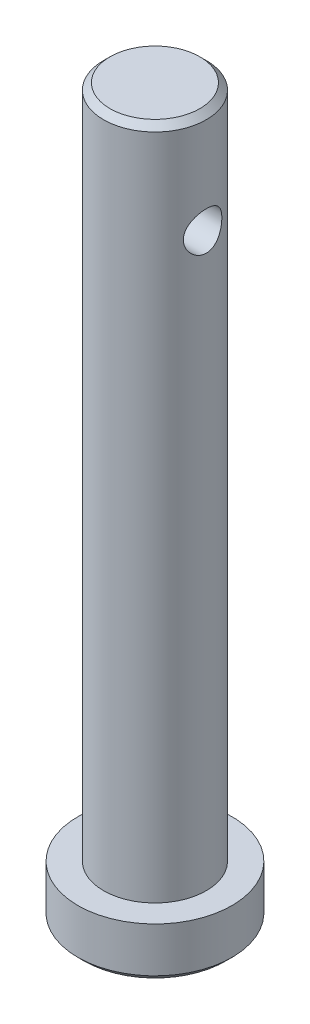
ISO-10303-21;
HEADER;
FILE_DESCRIPTION(('STEP AP214'),'2;1');
FILE_NAME('part.step','',(''),(''),'','','');
FILE_SCHEMA(('AUTOMOTIVE_DESIGN { 1 0 10303 214 1 1 1 1 }'));
ENDSEC;
DATA;
#1=APPLICATION_CONTEXT('core data for automotive mechanical design processes');
#2=APPLICATION_PROTOCOL_DEFINITION('international standard','automotive_design',2000,#1);
#3=PRODUCT_CONTEXT('',#1,'mechanical');
#4=PRODUCT('Part','Part','',(#3));
#5=PRODUCT_RELATED_PRODUCT_CATEGORY('part','',(#4));
#6=PRODUCT_DEFINITION_FORMATION('','',#4);
#7=PRODUCT_DEFINITION_CONTEXT('part definition',#1,'design');
#8=PRODUCT_DEFINITION('design','',#6,#7);
#9=PRODUCT_DEFINITION_SHAPE('','',#8);
#10=(LENGTH_UNIT() NAMED_UNIT(*) SI_UNIT(.MILLI.,.METRE.));
#11=(NAMED_UNIT(*) PLANE_ANGLE_UNIT() SI_UNIT($,.RADIAN.));
#12=(NAMED_UNIT(*) SI_UNIT($,.STERADIAN.) SOLID_ANGLE_UNIT());
#13=UNCERTAINTY_MEASURE_WITH_UNIT(LENGTH_MEASURE(1.E-05),#10,'distance_accuracy_value','');
#14=(GEOMETRIC_REPRESENTATION_CONTEXT(3) GLOBAL_UNCERTAINTY_ASSIGNED_CONTEXT((#13)) GLOBAL_UNIT_ASSIGNED_CONTEXT((#10,
#11,#12)) REPRESENTATION_CONTEXT('',''));
#15=CARTESIAN_POINT('',(0.,0.,0.));
#16=DIRECTION('',(0.,0.,1.));
#17=DIRECTION('',(1.,0.,0.));
#18=AXIS2_PLACEMENT_3D('',#15,#16,#17);
#19=CARTESIAN_POINT('',(0.,8.,0.));
#20=DIRECTION('',(0.,-1.,0.));
#21=DIRECTION('',(0.,0.,-1.));
#22=AXIS2_PLACEMENT_3D('',#19,#20,#21);
#23=CYLINDRICAL_SURFACE('',#22,12.);
#24=CARTESIAN_POINT('',(0.,1.,0.));
#25=DIRECTION('',(0.,1.,0.));
#26=DIRECTION('',(0.,0.,1.));
#27=AXIS2_PLACEMENT_3D('',#24,#25,#26);
#28=CIRCLE('',#27,12.);
#29=CARTESIAN_POINT('',(0.,1.,12.));
#30=VERTEX_POINT('',#29);
#31=EDGE_CURVE('E111',#30,#30,#28,.T.);
#32=ORIENTED_EDGE('',*,*,#31,.T.);
#33=EDGE_LOOP('',(#32));
#34=FACE_BOUND('',#33,.T.);
#35=CARTESIAN_POINT('',(0.,8.,0.));
#36=DIRECTION('',(0.,1.,0.));
#37=DIRECTION('',(0.,0.,1.));
#38=AXIS2_PLACEMENT_3D('',#35,#36,#37);
#39=CIRCLE('',#38,12.);
#40=CARTESIAN_POINT('',(0.,8.,12.));
#41=VERTEX_POINT('',#40);
#42=EDGE_CURVE('E112',#41,#41,#39,.T.);
#43=ORIENTED_EDGE('',*,*,#42,.F.);
#44=EDGE_LOOP('',(#43));
#45=FACE_BOUND('',#44,.T.);
#46=ADVANCED_FACE('F39',(#34,#45),#23,.T.);
#47=CARTESIAN_POINT('',(0.,8.,0.));
#48=DIRECTION('',(0.,1.,0.));
#49=DIRECTION('',(0.,0.,1.));
#50=AXIS2_PLACEMENT_3D('',#47,#48,#49);
#51=PLANE('',#50);
#52=CARTESIAN_POINT('',(0.,8.,0.));
#53=DIRECTION('',(0.,1.,0.));
#54=DIRECTION('',(0.,0.,1.));
#55=AXIS2_PLACEMENT_3D('',#52,#53,#54);
#56=CIRCLE('',#55,8.);
#57=CARTESIAN_POINT('',(0.,8.,8.));
#58=VERTEX_POINT('',#57);
#59=EDGE_CURVE('E58',#58,#58,#56,.T.);
#60=ORIENTED_EDGE('',*,*,#59,.F.);
#61=EDGE_LOOP('',(#60));
#62=FACE_BOUND('',#61,.T.);
#63=ORIENTED_EDGE('',*,*,#42,.T.);
#64=EDGE_LOOP('',(#63));
#65=FACE_BOUND('',#64,.T.);
#66=ADVANCED_FACE('F87',(#62,#65),#51,.T.);
#67=CARTESIAN_POINT('',(0.,0.,0.));
#68=DIRECTION('',(0.,1.,0.));
#69=DIRECTION('',(0.,0.,1.));
#70=AXIS2_PLACEMENT_3D('',#67,#68,#69);
#71=PLANE('',#70);
#72=CARTESIAN_POINT('',(0.,0.,0.));
#73=DIRECTION('',(0.,1.,0.));
#74=DIRECTION('',(0.,0.,1.));
#75=AXIS2_PLACEMENT_3D('',#72,#73,#74);
#76=CIRCLE('',#75,11.);
#77=CARTESIAN_POINT('',(0.,0.,11.));
#78=VERTEX_POINT('',#77);
#79=EDGE_CURVE('E109',#78,#78,#76,.F.);
#80=ORIENTED_EDGE('',*,*,#79,.T.);
#81=EDGE_LOOP('',(#80));
#82=FACE_BOUND('',#81,.T.);
#83=ADVANCED_FACE('F93',(#82),#71,.F.);
#84=CARTESIAN_POINT('',(0.,1.,0.));
#85=DIRECTION('',(0.,1.,0.));
#86=DIRECTION('',(0.,0.,1.));
#87=AXIS2_PLACEMENT_3D('',#84,#85,#86);
#88=CONICAL_SURFACE('',#87,12.,0.785398163397449);
#89=ORIENTED_EDGE('',*,*,#79,.F.);
#90=EDGE_LOOP('',(#89));
#91=FACE_BOUND('',#90,.T.);
#92=ORIENTED_EDGE('',*,*,#31,.F.);
#93=EDGE_LOOP('',(#92));
#94=FACE_BOUND('',#93,.T.);
#95=ADVANCED_FACE('F84',(#91,#94),#88,.T.);
#96=CARTESIAN_POINT('',(0.,113.,0.));
#97=DIRECTION('',(0.,-1.,0.));
#98=DIRECTION('',(0.,0.,-1.));
#99=AXIS2_PLACEMENT_3D('',#96,#97,#98);
#100=CYLINDRICAL_SURFACE('',#99,8.);
#101=CARTESIAN_POINT('',(-7.41619848709566,97.,-3.00000000000001));
#102=CARTESIAN_POINT('',(-7.41619281215226,97.1620149674834,-3.00000608211288));
#103=CARTESIAN_POINT('',(-7.42156520296313,97.3239898451262,-2.98683195095364));
#104=CARTESIAN_POINT('',(-7.44232318425765,97.6430561659352,-2.93472375787484));
#105=CARTESIAN_POINT('',(-7.45770847484803,97.8001477552117,-2.89579046745933));
#106=CARTESIAN_POINT('',(-7.49650960610891,98.1047507431888,-2.79379315222298));
#107=CARTESIAN_POINT('',(-7.51990619151695,98.2522841132919,-2.73078694533006));
#108=CARTESIAN_POINT('',(-7.57206268400017,98.5347437936479,-2.58263713485087));
#109=CARTESIAN_POINT('',(-7.60082420131042,98.6696663005679,-2.49748688189993));
#110=CARTESIAN_POINT('',(-7.66207149335192,98.9297806232427,-2.30293322748412));
#111=CARTESIAN_POINT('',(-7.69466683848217,99.054257059258,-2.19260762426636));
#112=CARTESIAN_POINT('',(-7.75899501256083,99.2834456293438,-1.95279167955761));
#113=CARTESIAN_POINT('',(-7.79072765629295,99.3881535474839,-1.8232972605133));
#114=CARTESIAN_POINT('',(-7.8510574787339,99.578279024591,-1.54338931035527));
#115=CARTESIAN_POINT('',(-7.87951122447087,99.6629189494317,-1.39241389507608));
#116=CARTESIAN_POINT('',(-7.92876015947619,99.8053023450499,-1.07711154393048));
#117=CARTESIAN_POINT('',(-7.94955800433994,99.863055143984,-0.912789261867069));
#118=CARTESIAN_POINT('',(-7.98037394206897,99.9475157915492,-0.582978683353672));
#119=CARTESIAN_POINT('',(-7.99081830429549,99.9754552548809,-0.4178463945632));
#120=CARTESIAN_POINT('',(-8.0012802821588,100.00344240189,-0.0849287275895698));
#121=CARTESIAN_POINT('',(-8.0013012882982,100.003499155237,0.082855770125677));
#122=CARTESIAN_POINT('',(-7.99118531807774,99.9764364770697,0.407487086128937));
#123=CARTESIAN_POINT('',(-7.98155083993307,99.9506614041024,0.564464356533753));
#124=CARTESIAN_POINT('',(-7.95386549864585,99.8749281695488,0.871678435968828));
#125=CARTESIAN_POINT('',(-7.93581403951378,99.8249682954757,1.02191476686077));
#126=CARTESIAN_POINT('',(-7.89275538334835,99.7016590966486,1.31397803460604));
#127=CARTESIAN_POINT('',(-7.86765078939303,99.6279799894642,1.45565078457397));
#128=CARTESIAN_POINT('',(-7.81302620451409,99.4596158061402,1.72497321591576));
#129=CARTESIAN_POINT('',(-7.78350479028858,99.364923953961,1.85261835386705));
#130=CARTESIAN_POINT('',(-7.72105059308269,99.1507454274377,2.09818097359933));
#131=CARTESIAN_POINT('',(-7.68801927514871,99.0301321687147,2.21509229051721));
#132=CARTESIAN_POINT('',(-7.62364921304341,98.7708140133413,2.42740791139661));
#133=CARTESIAN_POINT('',(-7.59231089545926,98.6321045867686,2.5228068138945));
#134=CARTESIAN_POINT('',(-7.53425406951149,98.3365610651226,2.69131223613209));
#135=CARTESIAN_POINT('',(-7.50765354114236,98.1793930128285,2.76387695690677));
#136=CARTESIAN_POINT('',(-7.4634487707231,97.8538075498722,2.88112928869848));
#137=CARTESIAN_POINT('',(-7.44583952363152,97.6853964568743,2.925832412077));
#138=CARTESIAN_POINT('',(-7.4227919449154,97.3520480753245,2.98380383422379));
#139=CARTESIAN_POINT('',(-7.41673570495336,97.187431788916,2.99867042318746));
#140=CARTESIAN_POINT('',(-7.41573079037772,96.8579812865282,3.00115771271732));
#141=CARTESIAN_POINT('',(-7.42077934004762,96.6931471352981,2.98878522187311));
#142=CARTESIAN_POINT('',(-7.44078763262528,96.3761401554217,2.93859467040517));
#143=CARTESIAN_POINT('',(-7.45526552433718,96.2237377284699,2.90201236668504));
#144=CARTESIAN_POINT('',(-7.49192974091902,95.9273041105604,2.80599549281221));
#145=CARTESIAN_POINT('',(-7.51411764500121,95.7832746416639,2.74655624069232));
#146=CARTESIAN_POINT('',(-7.56472486232391,95.5016711238473,2.60400584550572));
#147=CARTESIAN_POINT('',(-7.59334657784192,95.3645414157252,2.52009090354098));
#148=CARTESIAN_POINT('',(-7.6532562858852,95.105742036548,2.33182635724955));
#149=CARTESIAN_POINT('',(-7.68454525188137,94.9840780507507,2.22746927392869));
#150=CARTESIAN_POINT('',(-7.74866093106386,94.7516632536098,1.99345468180189));
#151=CARTESIAN_POINT('',(-7.7814593871406,94.6420931824625,1.86261268298213));
#152=CARTESIAN_POINT('',(-7.84299749926599,94.4463232648211,1.5835949435063));
#153=CARTESIAN_POINT('',(-7.87173714215327,94.3601234941083,1.43541914664535));
#154=CARTESIAN_POINT('',(-7.92189971409105,94.2141078876007,1.12603265893695));
#155=CARTESIAN_POINT('',(-7.9433476267602,94.1542017524148,0.964868866129253));
#156=CARTESIAN_POINT('',(-7.97658873425142,94.0626871723002,0.633763775046511));
#157=CARTESIAN_POINT('',(-7.98838646598825,94.0310654291552,0.46382664144719));
#158=CARTESIAN_POINT('',(-8.00056814634146,93.9984511944903,0.130671170547637));
#159=CARTESIAN_POINT('',(-8.00157721907528,93.995781033882,-0.0323615361216857));
#160=CARTESIAN_POINT('',(-7.99369779618447,94.0168303188908,-0.356453572824845));
#161=CARTESIAN_POINT('',(-7.98481049426262,94.0405465817717,-0.517513138490513));
#162=CARTESIAN_POINT('',(-7.95842179207541,94.1125177029872,-0.829096496754252));
#163=CARTESIAN_POINT('',(-7.9411358275603,94.1601598117567,-0.979781462137667));
#164=CARTESIAN_POINT('',(-7.89975567241984,94.2780200267687,-1.27103094601278));
#165=CARTESIAN_POINT('',(-7.87566019311345,94.3482424066095,-1.41159354255109));
#166=CARTESIAN_POINT('',(-7.8218123660013,94.5126278870096,-1.68508035398882));
#167=CARTESIAN_POINT('',(-7.79186480217587,94.6076732810283,-1.81743509769369));
#168=CARTESIAN_POINT('',(-7.72999015389759,94.8176156603752,-2.06483469504674));
#169=CARTESIAN_POINT('',(-7.69806236548316,94.9325197316156,-2.17987334251185));
#170=CARTESIAN_POINT('',(-7.63376259478074,95.1861282632902,-2.39562428472387));
#171=CARTESIAN_POINT('',(-7.60145610697262,95.3257688043091,-2.49525999632032));
#172=CARTESIAN_POINT('',(-7.54196650008334,95.6208317391462,-2.66969419113706));
#173=CARTESIAN_POINT('',(-7.51478391266386,95.7762557681052,-2.74449009756384));
#174=CARTESIAN_POINT('',(-7.46804539702406,96.1059113619526,-2.86931773948448));
#175=CARTESIAN_POINT('',(-7.44887606566003,96.2806687330304,-2.91812005798767));
#176=CARTESIAN_POINT('',(-7.42295988688336,96.6369705439047,-2.98344713444438));
#177=CARTESIAN_POINT('',(-7.41620484418155,96.8185104253944,-2.99999318680185));
#178=CARTESIAN_POINT('',(-7.41619848709566,97.,-3.00000000000001));
#179=B_SPLINE_CURVE_WITH_KNOTS('',3,(#101,#102,#103,#104,#105,#106,#107,#108,#109,#110,#111,
#112,#113,#114,#115,#116,#117,#118,#119,#120,#121,#122,#123,#124,#125,#126,#127,#128,#129,#130,
#131,#132,#133,#134,#135,#136,#137,#138,#139,#140,#141,#142,#143,#144,#145,#146,#147,#148,#149,
#150,#151,#152,#153,#154,#155,#156,#157,#158,#159,#160,#161,#162,#163,#164,#165,#166,#167,#168,
#169,#170,#171,#172,#173,#174,#175,#176,#177,#178),.UNSPECIFIED.,.T.,.F.,(4,2,2,2,2,2,2,2,2,2,2,
2,2,2,2,2,2,2,2,2,2,2,2,2,2,2,2,2,2,2,2,2,2,2,2,2,2,2,4),(0.,0.485369082889289,
0.970723629307669,1.45491971362402,1.93926135947585,2.44549304813253,2.95183257656963,
3.47540144283839,3.99878852773657,4.49960036990355,5.00024930820711,5.47612945617385,
5.95204330537668,6.43488262432333,6.91787787268949,7.42913350142746,7.94051735665667,
8.46325184520833,8.98569503290591,9.47931315500613,9.97280790797413,10.4428769187604,
10.913042268787,11.4008312203129,11.8887989695235,12.4077003400689,12.9266033932,
13.4437101779998,13.960573711399,14.4473144111952,14.933996406586,15.4088054802743,
15.8837044704531,16.3785664737362,16.8736054180957,17.394771991038,17.9159926110813,
18.460063577615,19.0037752466575),.UNSPECIFIED.);
#180=CARTESIAN_POINT('',(-7.41619848709566,97.,-3.00000000000001));
#181=VERTEX_POINT('',#180);
#182=EDGE_CURVE('E44',#181,#181,#179,.T.);
#183=ORIENTED_EDGE('',*,*,#182,.T.);
#184=EDGE_LOOP('',(#183));
#185=FACE_BOUND('',#184,.T.);
#186=CARTESIAN_POINT('',(7.41619848709566,97.,-3.00000000000001));
#187=CARTESIAN_POINT('',(7.41619281215226,96.8379850325166,-3.00000608211288));
#188=CARTESIAN_POINT('',(7.42156520296313,96.6760101548738,-2.98683195095364));
#189=CARTESIAN_POINT('',(7.44232318425765,96.3569438340648,-2.93472375787484));
#190=CARTESIAN_POINT('',(7.45770847484803,96.1998522447883,-2.89579046745933));
#191=CARTESIAN_POINT('',(7.49650960610891,95.8952492568112,-2.79379315222298));
#192=CARTESIAN_POINT('',(7.51990619151695,95.7477158867081,-2.73078694533006));
#193=CARTESIAN_POINT('',(7.57206268400017,95.465256206352,-2.58263713485087));
#194=CARTESIAN_POINT('',(7.60082420131042,95.3303336994321,-2.49748688189993));
#195=CARTESIAN_POINT('',(7.66207149335192,95.0702193767573,-2.30293322748412));
#196=CARTESIAN_POINT('',(7.69466683848217,94.945742940742,-2.19260762426636));
#197=CARTESIAN_POINT('',(7.75899501256083,94.7165543706562,-1.95279167955761));
#198=CARTESIAN_POINT('',(7.79072765629295,94.611846452516,-1.8232972605133));
#199=CARTESIAN_POINT('',(7.8510574787339,94.421720975409,-1.54338931035527));
#200=CARTESIAN_POINT('',(7.87951122447087,94.3370810505683,-1.39241389507608));
#201=CARTESIAN_POINT('',(7.92876015947619,94.1946976549501,-1.07711154393048));
#202=CARTESIAN_POINT('',(7.94955800433994,94.136944856016,-0.912789261867069));
#203=CARTESIAN_POINT('',(7.98037394206897,94.0524842084508,-0.582978683353672));
#204=CARTESIAN_POINT('',(7.99081830429549,94.0245447451191,-0.4178463945632));
#205=CARTESIAN_POINT('',(8.0012802821588,93.99655759811,-0.0849287275895698));
#206=CARTESIAN_POINT('',(8.0013012882982,93.9965008447626,0.082855770125677));
#207=CARTESIAN_POINT('',(7.99118531807774,94.0235635229303,0.407487086128937));
#208=CARTESIAN_POINT('',(7.98155083993307,94.0493385958975,0.564464356533753));
#209=CARTESIAN_POINT('',(7.95386549864585,94.1250718304512,0.871678435968828));
#210=CARTESIAN_POINT('',(7.93581403951378,94.1750317045243,1.02191476686077));
#211=CARTESIAN_POINT('',(7.89275538334835,94.2983409033514,1.31397803460604));
#212=CARTESIAN_POINT('',(7.86765078939303,94.3720200105358,1.45565078457397));
#213=CARTESIAN_POINT('',(7.81302620451409,94.5403841938598,1.72497321591576));
#214=CARTESIAN_POINT('',(7.78350479028858,94.635076046039,1.85261835386705));
#215=CARTESIAN_POINT('',(7.72105059308269,94.8492545725623,2.09818097359933));
#216=CARTESIAN_POINT('',(7.68801927514871,94.9698678312853,2.21509229051721));
#217=CARTESIAN_POINT('',(7.62364921304341,95.2291859866586,2.42740791139661));
#218=CARTESIAN_POINT('',(7.59231089545926,95.3678954132314,2.5228068138945));
#219=CARTESIAN_POINT('',(7.53425406951149,95.6634389348773,2.69131223613209));
#220=CARTESIAN_POINT('',(7.50765354114235,95.8206069871714,2.76387695690677));
#221=CARTESIAN_POINT('',(7.4634487707231,96.1461924501277,2.88112928869848));
#222=CARTESIAN_POINT('',(7.44583952363152,96.3146035431257,2.925832412077));
#223=CARTESIAN_POINT('',(7.4227919449154,96.6479519246755,2.98380383422379));
#224=CARTESIAN_POINT('',(7.41673570495336,96.8125682110839,2.99867042318746));
#225=CARTESIAN_POINT('',(7.41573079037772,97.1420187134718,3.00115771271732));
#226=CARTESIAN_POINT('',(7.42077934004762,97.3068528647019,2.98878522187311));
#227=CARTESIAN_POINT('',(7.44078763262528,97.6238598445783,2.93859467040517));
#228=CARTESIAN_POINT('',(7.45526552433718,97.7762622715301,2.90201236668504));
#229=CARTESIAN_POINT('',(7.49192974091902,98.0726958894396,2.80599549281221));
#230=CARTESIAN_POINT('',(7.51411764500121,98.216725358336,2.74655624069232));
#231=CARTESIAN_POINT('',(7.56472486232391,98.4983288761526,2.60400584550571));
#232=CARTESIAN_POINT('',(7.59334657784192,98.6354585842747,2.52009090354098));
#233=CARTESIAN_POINT('',(7.6532562858852,98.894257963452,2.33182635724954));
#234=CARTESIAN_POINT('',(7.68454525188137,99.0159219492493,2.22746927392868));
#235=CARTESIAN_POINT('',(7.74866093106386,99.2483367463902,1.99345468180189));
#236=CARTESIAN_POINT('',(7.7814593871406,99.3579068175375,1.86261268298212));
#237=CARTESIAN_POINT('',(7.84299749926599,99.5536767351789,1.58359494350629));
#238=CARTESIAN_POINT('',(7.87173714215327,99.6398765058917,1.43541914664534));
#239=CARTESIAN_POINT('',(7.92189971409105,99.7858921123992,1.12603265893695));
#240=CARTESIAN_POINT('',(7.9433476267602,99.8457982475852,0.964868866129253));
#241=CARTESIAN_POINT('',(7.97658873425142,99.9373128276998,0.633763775046511));
#242=CARTESIAN_POINT('',(7.98838646598825,99.9689345708448,0.46382664144719));
#243=CARTESIAN_POINT('',(8.00056814634146,100.00154880551,0.130671170547637));
#244=CARTESIAN_POINT('',(8.00157721907528,100.004218966118,-0.0323615361216857));
#245=CARTESIAN_POINT('',(7.99369779618447,99.9831696811092,-0.356453572824845));
#246=CARTESIAN_POINT('',(7.98481049426262,99.9594534182283,-0.517513138490513));
#247=CARTESIAN_POINT('',(7.95842179207541,99.8874822970128,-0.829096496754252));
#248=CARTESIAN_POINT('',(7.9411358275603,99.8398401882433,-0.979781462137667));
#249=CARTESIAN_POINT('',(7.89975567241984,99.7219799732313,-1.27103094601278));
#250=CARTESIAN_POINT('',(7.87566019311345,99.6517575933905,-1.41159354255109));
#251=CARTESIAN_POINT('',(7.8218123660013,99.4873721129904,-1.68508035398882));
#252=CARTESIAN_POINT('',(7.79186480217587,99.3923267189717,-1.81743509769369));
#253=CARTESIAN_POINT('',(7.72999015389759,99.1823843396248,-2.06483469504674));
#254=CARTESIAN_POINT('',(7.69806236548316,99.0674802683844,-2.17987334251185));
#255=CARTESIAN_POINT('',(7.63376259478074,98.8138717367098,-2.39562428472387));
#256=CARTESIAN_POINT('',(7.60145610697262,98.6742311956909,-2.49525999632032));
#257=CARTESIAN_POINT('',(7.54196650008334,98.3791682608538,-2.66969419113706));
#258=CARTESIAN_POINT('',(7.51478391266386,98.2237442318947,-2.74449009756384));
#259=CARTESIAN_POINT('',(7.46804539702406,97.8940886380474,-2.86931773948448));
#260=CARTESIAN_POINT('',(7.44887606566003,97.7193312669696,-2.91812005798767));
#261=CARTESIAN_POINT('',(7.42295988688336,97.3630294560953,-2.98344713444438));
#262=CARTESIAN_POINT('',(7.41620484418155,97.1814895746056,-2.99999318680185));
#263=CARTESIAN_POINT('',(7.41619848709566,97.,-3.00000000000001));
#264=B_SPLINE_CURVE_WITH_KNOTS('',3,(#186,#187,#188,#189,#190,#191,#192,#193,#194,#195,#196,
#197,#198,#199,#200,#201,#202,#203,#204,#205,#206,#207,#208,#209,#210,#211,#212,#213,#214,#215,
#216,#217,#218,#219,#220,#221,#222,#223,#224,#225,#226,#227,#228,#229,#230,#231,#232,#233,#234,
#235,#236,#237,#238,#239,#240,#241,#242,#243,#244,#245,#246,#247,#248,#249,#250,#251,#252,#253,
#254,#255,#256,#257,#258,#259,#260,#261,#262,#263),.UNSPECIFIED.,.T.,.F.,(4,2,2,2,2,2,2,2,2,2,2,
2,2,2,2,2,2,2,2,2,2,2,2,2,2,2,2,2,2,2,2,2,2,2,2,2,2,2,4),(0.,0.485369082889289,
0.970723629307669,1.45491971362402,1.93926135947585,2.44549304813253,2.95183257656963,
3.47540144283839,3.99878852773657,4.49960036990355,5.00024930820711,5.47612945617385,
5.95204330537668,6.43488262432333,6.91787787268949,7.42913350142746,7.94051735665667,
8.46325184520834,8.98569503290591,9.47931315500613,9.97280790797413,10.4428769187604,
10.913042268787,11.4008312203129,11.8887989695235,12.4077003400689,12.9266033932,
13.4437101779998,13.960573711399,14.4473144111952,14.933996406586,15.4088054802743,
15.8837044704531,16.3785664737362,16.8736054180957,17.394771991038,17.9159926110813,
18.460063577615,19.0037752466575),.UNSPECIFIED.);
#265=CARTESIAN_POINT('',(7.41619848709566,97.,-3.00000000000001));
#266=VERTEX_POINT('',#265);
#267=EDGE_CURVE('E61',#266,#266,#264,.T.);
#268=ORIENTED_EDGE('',*,*,#267,.T.);
#269=EDGE_LOOP('',(#268));
#270=FACE_BOUND('',#269,.T.);
#271=CARTESIAN_POINT('',(0.,112.,0.));
#272=DIRECTION('',(0.,1.,0.));
#273=DIRECTION('',(0.,0.,1.));
#274=AXIS2_PLACEMENT_3D('',#271,#272,#273);
#275=CIRCLE('',#274,8.);
#276=CARTESIAN_POINT('',(0.,112.,8.));
#277=VERTEX_POINT('',#276);
#278=EDGE_CURVE('E10',#277,#277,#275,.F.);
#279=ORIENTED_EDGE('',*,*,#278,.T.);
#280=EDGE_LOOP('',(#279));
#281=FACE_BOUND('',#280,.T.);
#282=ORIENTED_EDGE('',*,*,#59,.T.);
#283=EDGE_LOOP('',(#282));
#284=FACE_BOUND('',#283,.T.);
#285=ADVANCED_FACE('F66',(#185,#270,#281,#284),#100,.T.);
#286=CARTESIAN_POINT('',(0.,113.,0.));
#287=DIRECTION('',(0.,1.,0.));
#288=DIRECTION('',(0.,0.,1.));
#289=AXIS2_PLACEMENT_3D('',#286,#287,#288);
#290=PLANE('',#289);
#291=CARTESIAN_POINT('',(0.,113.,0.));
#292=DIRECTION('',(0.,1.,0.));
#293=DIRECTION('',(0.,0.,1.));
#294=AXIS2_PLACEMENT_3D('',#291,#292,#293);
#295=CIRCLE('',#294,7.00000000000001);
#296=CARTESIAN_POINT('',(0.,113.,7.00000000000001));
#297=VERTEX_POINT('',#296);
#298=EDGE_CURVE('E53',#297,#297,#295,.T.);
#299=ORIENTED_EDGE('',*,*,#298,.T.);
#300=EDGE_LOOP('',(#299));
#301=FACE_BOUND('',#300,.T.);
#302=ADVANCED_FACE('F74',(#301),#290,.T.);
#303=CARTESIAN_POINT('',(0.,113.,0.));
#304=DIRECTION('',(0.,-1.,0.));
#305=DIRECTION('',(0.,0.,-1.));
#306=AXIS2_PLACEMENT_3D('',#303,#304,#305);
#307=CONICAL_SURFACE('',#306,7.00000000000001,0.785398163397445);
#308=ORIENTED_EDGE('',*,*,#278,.F.);
#309=EDGE_LOOP('',(#308));
#310=FACE_BOUND('',#309,.T.);
#311=ORIENTED_EDGE('',*,*,#298,.F.);
#312=EDGE_LOOP('',(#311));
#313=FACE_BOUND('',#312,.T.);
#314=ADVANCED_FACE('F42',(#310,#313),#307,.T.);
#315=CARTESIAN_POINT('',(-12.,97.,0.));
#316=DIRECTION('',(1.,0.,0.));
#317=DIRECTION('',(0.,0.,-1.));
#318=AXIS2_PLACEMENT_3D('',#315,#316,#317);
#319=CYLINDRICAL_SURFACE('',#318,3.00000000000001);
#320=ORIENTED_EDGE('',*,*,#267,.F.);
#321=EDGE_LOOP('',(#320));
#322=FACE_BOUND('',#321,.T.);
#323=ORIENTED_EDGE('',*,*,#182,.F.);
#324=EDGE_LOOP('',(#323));
#325=FACE_BOUND('',#324,.T.);
#326=ADVANCED_FACE('F70',(#322,#325),#319,.F.);
#327=CLOSED_SHELL('',(#46,#66,#83,#95,#285,#302,#314,#326));
#328=MANIFOLD_SOLID_BREP('B2',#327);
#329=ADVANCED_BREP_SHAPE_REPRESENTATION('',(#18,#328),#14);
#330=SHAPE_DEFINITION_REPRESENTATION(#9,#329);
ENDSEC;
END-ISO-10303-21;
